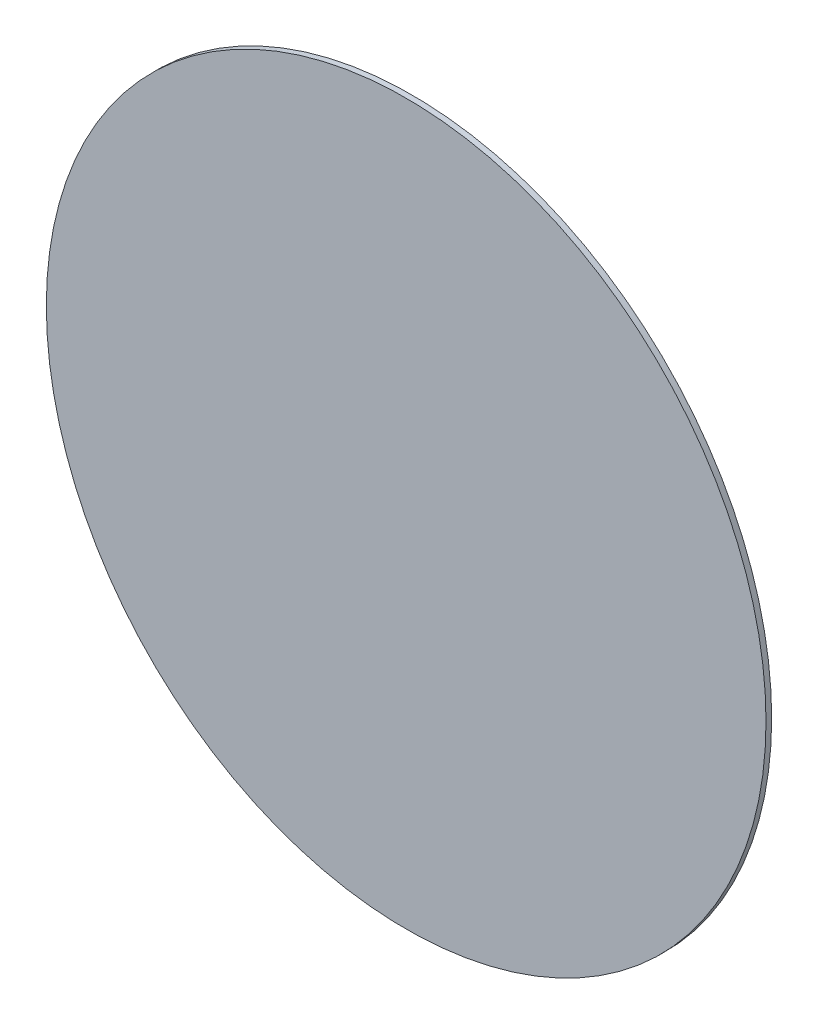
ISO-10303-21;
HEADER;
FILE_DESCRIPTION(('STEP AP214'),'2;1');
FILE_NAME('part.step','',(''),(''),'','','');
FILE_SCHEMA(('AUTOMOTIVE_DESIGN { 1 0 10303 214 1 1 1 1 }'));
ENDSEC;
DATA;
#1=APPLICATION_CONTEXT('core data for automotive mechanical design processes');
#2=APPLICATION_PROTOCOL_DEFINITION('international standard','automotive_design',2000,#1);
#3=PRODUCT_CONTEXT('',#1,'mechanical');
#4=PRODUCT('Part','Part','',(#3));
#5=PRODUCT_RELATED_PRODUCT_CATEGORY('part','',(#4));
#6=PRODUCT_DEFINITION_FORMATION('','',#4);
#7=PRODUCT_DEFINITION_CONTEXT('part definition',#1,'design');
#8=PRODUCT_DEFINITION('design','',#6,#7);
#9=PRODUCT_DEFINITION_SHAPE('','',#8);
#10=(LENGTH_UNIT() NAMED_UNIT(*) SI_UNIT(.MILLI.,.METRE.));
#11=(NAMED_UNIT(*) PLANE_ANGLE_UNIT() SI_UNIT($,.RADIAN.));
#12=(NAMED_UNIT(*) SI_UNIT($,.STERADIAN.) SOLID_ANGLE_UNIT());
#13=UNCERTAINTY_MEASURE_WITH_UNIT(LENGTH_MEASURE(1.E-05),#10,'distance_accuracy_value','');
#14=(GEOMETRIC_REPRESENTATION_CONTEXT(3) GLOBAL_UNCERTAINTY_ASSIGNED_CONTEXT((#13)) GLOBAL_UNIT_ASSIGNED_CONTEXT((#10,
#11,#12)) REPRESENTATION_CONTEXT('',''));
#15=CARTESIAN_POINT('',(0.,0.,0.));
#16=DIRECTION('',(0.,0.,1.));
#17=DIRECTION('',(1.,0.,0.));
#18=AXIS2_PLACEMENT_3D('',#15,#16,#17);
#19=CARTESIAN_POINT('',(0.,0.,1.));
#20=DIRECTION('',(0.,0.,-1.));
#21=DIRECTION('',(-1.,0.,0.));
#22=AXIS2_PLACEMENT_3D('',#19,#20,#21);
#23=CYLINDRICAL_SURFACE('',#22,63.5);
#24=CARTESIAN_POINT('',(0.,0.,1.));
#25=DIRECTION('',(0.,0.,1.));
#26=DIRECTION('',(1.,0.,0.));
#27=AXIS2_PLACEMENT_3D('',#24,#25,#26);
#28=CIRCLE('',#27,63.5);
#29=CARTESIAN_POINT('',(63.5,0.,1.));
#30=VERTEX_POINT('',#29);
#31=EDGE_CURVE('E10',#30,#30,#28,.T.);
#32=ORIENTED_EDGE('',*,*,#31,.F.);
#33=EDGE_LOOP('',(#32));
#34=FACE_BOUND('',#33,.T.);
#35=CARTESIAN_POINT('',(0.,0.,0.));
#36=DIRECTION('',(0.,0.,1.));
#37=DIRECTION('',(1.,0.,0.));
#38=AXIS2_PLACEMENT_3D('',#35,#36,#37);
#39=CIRCLE('',#38,63.5);
#40=CARTESIAN_POINT('',(63.5,0.,0.));
#41=VERTEX_POINT('',#40);
#42=EDGE_CURVE('E40',#41,#41,#39,.T.);
#43=ORIENTED_EDGE('',*,*,#42,.T.);
#44=EDGE_LOOP('',(#43));
#45=FACE_BOUND('',#44,.T.);
#46=ADVANCED_FACE('F37',(#34,#45),#23,.T.);
#47=CARTESIAN_POINT('',(0.,0.,1.));
#48=DIRECTION('',(0.,0.,1.));
#49=DIRECTION('',(1.,0.,0.));
#50=AXIS2_PLACEMENT_3D('',#47,#48,#49);
#51=PLANE('',#50);
#52=ORIENTED_EDGE('',*,*,#31,.T.);
#53=EDGE_LOOP('',(#52));
#54=FACE_BOUND('',#53,.T.);
#55=ADVANCED_FACE('F54',(#54),#51,.T.);
#56=CARTESIAN_POINT('',(0.,0.,0.));
#57=DIRECTION('',(0.,0.,1.));
#58=DIRECTION('',(1.,0.,0.));
#59=AXIS2_PLACEMENT_3D('',#56,#57,#58);
#60=PLANE('',#59);
#61=ORIENTED_EDGE('',*,*,#42,.F.);
#62=EDGE_LOOP('',(#61));
#63=FACE_BOUND('',#62,.T.);
#64=ADVANCED_FACE('F52',(#63),#60,.F.);
#65=CLOSED_SHELL('',(#46,#55,#64));
#66=MANIFOLD_SOLID_BREP('B2',#65);
#67=ADVANCED_BREP_SHAPE_REPRESENTATION('',(#18,#66),#14);
#68=SHAPE_DEFINITION_REPRESENTATION(#9,#67);
ENDSEC;
END-ISO-10303-21;
